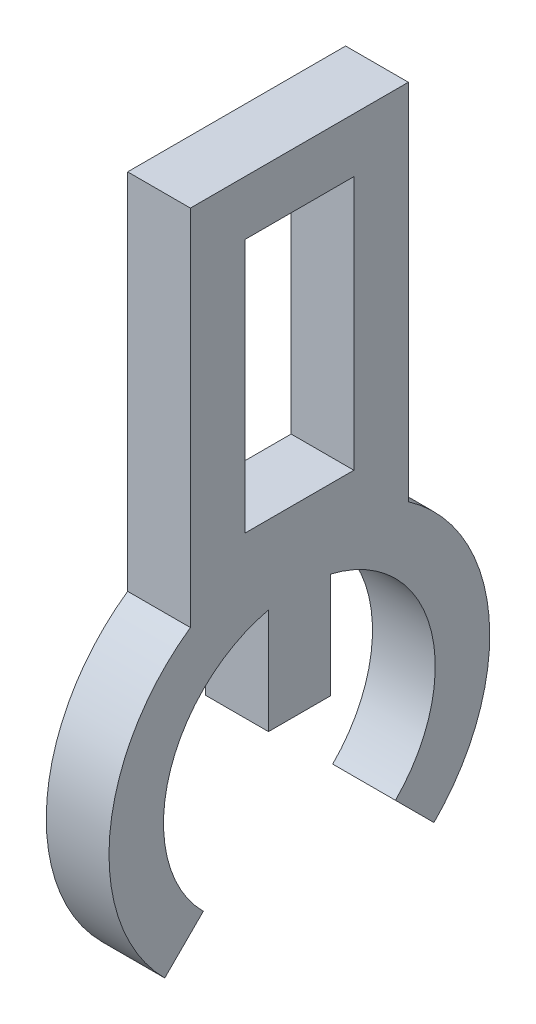
ISO-10303-21;
HEADER;
FILE_DESCRIPTION(('STEP AP214'),'2;1');
FILE_NAME('part.step','',(''),(''),'','','');
FILE_SCHEMA(('AUTOMOTIVE_DESIGN { 1 0 10303 214 1 1 1 1 }'));
ENDSEC;
DATA;
#1=APPLICATION_CONTEXT('core data for automotive mechanical design processes');
#2=APPLICATION_PROTOCOL_DEFINITION('international standard','automotive_design',2000,#1);
#3=PRODUCT_CONTEXT('',#1,'mechanical');
#4=PRODUCT('Part','Part','',(#3));
#5=PRODUCT_RELATED_PRODUCT_CATEGORY('part','',(#4));
#6=PRODUCT_DEFINITION_FORMATION('','',#4);
#7=PRODUCT_DEFINITION_CONTEXT('part definition',#1,'design');
#8=PRODUCT_DEFINITION('design','',#6,#7);
#9=PRODUCT_DEFINITION_SHAPE('','',#8);
#10=(LENGTH_UNIT() NAMED_UNIT(*) SI_UNIT(.MILLI.,.METRE.));
#11=(NAMED_UNIT(*) PLANE_ANGLE_UNIT() SI_UNIT($,.RADIAN.));
#12=(NAMED_UNIT(*) SI_UNIT($,.STERADIAN.) SOLID_ANGLE_UNIT());
#13=UNCERTAINTY_MEASURE_WITH_UNIT(LENGTH_MEASURE(1.E-05),#10,'distance_accuracy_value','');
#14=(GEOMETRIC_REPRESENTATION_CONTEXT(3) GLOBAL_UNCERTAINTY_ASSIGNED_CONTEXT((#13)) GLOBAL_UNIT_ASSIGNED_CONTEXT((#10,
#11,#12)) REPRESENTATION_CONTEXT('',''));
#15=CARTESIAN_POINT('',(0.,0.,0.));
#16=DIRECTION('',(0.,0.,1.));
#17=DIRECTION('',(1.,0.,0.));
#18=AXIS2_PLACEMENT_3D('',#15,#16,#17);
#19=CARTESIAN_POINT('',(1.7272,4.92565105429879,1.5));
#20=DIRECTION('',(0.,0.,-1.));
#21=DIRECTION('',(0.,1.,0.));
#22=AXIS2_PLACEMENT_3D('',#19,#20,#21);
#23=PLANE('',#22);
#24=DIRECTION('',(0.,-1.,0.));
#25=VECTOR('',#24,1.);
#26=CARTESIAN_POINT('',(0.,4.92565105429879,1.5));
#27=LINE('',#26,#25);
#28=CARTESIAN_POINT('',(0.,12.7962309062712,1.5));
#29=VERTEX_POINT('',#28);
#30=CARTESIAN_POINT('',(0.,5.79623090627122,1.5));
#31=VERTEX_POINT('',#30);
#32=EDGE_CURVE('E213',#29,#31,#27,.T.);
#33=ORIENTED_EDGE('',*,*,#32,.F.);
#34=DIRECTION('',(-1.,0.,0.));
#35=VECTOR('',#34,1.);
#36=CARTESIAN_POINT('',(1.7272,12.7962309062712,1.5));
#37=LINE('',#36,#35);
#38=CARTESIAN_POINT('',(1.7272,12.7962309062712,1.5));
#39=VERTEX_POINT('',#38);
#40=EDGE_CURVE('E11',#39,#29,#37,.T.);
#41=ORIENTED_EDGE('',*,*,#40,.F.);
#42=DIRECTION('',(0.,-1.,0.));
#43=VECTOR('',#42,1.);
#44=CARTESIAN_POINT('',(1.7272,4.92565105429879,1.5));
#45=LINE('',#44,#43);
#46=CARTESIAN_POINT('',(1.7272,5.79623090627122,1.5));
#47=VERTEX_POINT('',#46);
#48=EDGE_CURVE('E169',#39,#47,#45,.T.);
#49=ORIENTED_EDGE('',*,*,#48,.T.);
#50=DIRECTION('',(-1.,0.,0.));
#51=VECTOR('',#50,1.);
#52=CARTESIAN_POINT('',(1.7272,5.79623090627122,1.5));
#53=LINE('',#52,#51);
#54=EDGE_CURVE('E54',#47,#31,#53,.T.);
#55=ORIENTED_EDGE('',*,*,#54,.T.);
#56=EDGE_LOOP('',(#33,#41,#49,#55));
#57=FACE_BOUND('',#56,.T.);
#58=ADVANCED_FACE('F35',(#57),#23,.T.);
#59=CARTESIAN_POINT('',(1.7272,12.7962309062712,-15.8317009149584));
#60=DIRECTION('',(0.,1.,0.));
#61=DIRECTION('',(0.,0.,1.));
#62=AXIS2_PLACEMENT_3D('',#59,#60,#61);
#63=PLANE('',#62);
#64=DIRECTION('',(0.,0.,-1.));
#65=VECTOR('',#64,1.);
#66=CARTESIAN_POINT('',(0.,12.7962309062712,-15.8317009149584));
#67=LINE('',#66,#65);
#68=CARTESIAN_POINT('',(0.,12.7962309062712,-1.5));
#69=VERTEX_POINT('',#68);
#70=EDGE_CURVE('E174',#29,#69,#67,.T.);
#71=ORIENTED_EDGE('',*,*,#70,.T.);
#72=DIRECTION('',(-1.,0.,0.));
#73=VECTOR('',#72,1.);
#74=CARTESIAN_POINT('',(1.7272,12.7962309062712,-1.5));
#75=LINE('',#74,#73);
#76=CARTESIAN_POINT('',(1.7272,12.7962309062712,-1.5));
#77=VERTEX_POINT('',#76);
#78=EDGE_CURVE('E45',#77,#69,#75,.T.);
#79=ORIENTED_EDGE('',*,*,#78,.F.);
#80=DIRECTION('',(0.,0.,-1.));
#81=VECTOR('',#80,1.);
#82=CARTESIAN_POINT('',(1.7272,12.7962309062712,-15.8317009149584));
#83=LINE('',#82,#81);
#84=EDGE_CURVE('E164',#39,#77,#83,.T.);
#85=ORIENTED_EDGE('',*,*,#84,.F.);
#86=ORIENTED_EDGE('',*,*,#40,.T.);
#87=EDGE_LOOP('',(#71,#79,#85,#86));
#88=FACE_BOUND('',#87,.T.);
#89=ADVANCED_FACE('F172',(#88),#63,.F.);
#90=CARTESIAN_POINT('',(1.7272,4.92565105429879,-1.5));
#91=DIRECTION('',(0.,0.,-1.));
#92=DIRECTION('',(0.,1.,0.));
#93=AXIS2_PLACEMENT_3D('',#90,#91,#92);
#94=PLANE('',#93);
#95=DIRECTION('',(0.,-1.,0.));
#96=VECTOR('',#95,1.);
#97=CARTESIAN_POINT('',(0.,4.92565105429879,-1.5));
#98=LINE('',#97,#96);
#99=CARTESIAN_POINT('',(0.,5.79623090627122,-1.5));
#100=VERTEX_POINT('',#99);
#101=EDGE_CURVE('E210',#69,#100,#98,.T.);
#102=ORIENTED_EDGE('',*,*,#101,.T.);
#103=DIRECTION('',(-1.,0.,0.));
#104=VECTOR('',#103,1.);
#105=CARTESIAN_POINT('',(1.7272,5.79623090627122,-1.5));
#106=LINE('',#105,#104);
#107=CARTESIAN_POINT('',(1.7272,5.79623090627122,-1.5));
#108=VERTEX_POINT('',#107);
#109=EDGE_CURVE('E104',#108,#100,#106,.T.);
#110=ORIENTED_EDGE('',*,*,#109,.F.);
#111=DIRECTION('',(0.,-1.,0.));
#112=VECTOR('',#111,1.);
#113=CARTESIAN_POINT('',(1.7272,4.92565105429879,-1.5));
#114=LINE('',#113,#112);
#115=EDGE_CURVE('E156',#77,#108,#114,.T.);
#116=ORIENTED_EDGE('',*,*,#115,.F.);
#117=ORIENTED_EDGE('',*,*,#78,.T.);
#118=EDGE_LOOP('',(#102,#110,#116,#117));
#119=FACE_BOUND('',#118,.T.);
#120=ADVANCED_FACE('F158',(#119),#94,.F.);
#121=CARTESIAN_POINT('',(1.7272,0.,0.));
#122=DIRECTION('',(-1.,0.,0.));
#123=DIRECTION('',(0.,0.,1.));
#124=AXIS2_PLACEMENT_3D('',#121,#122,#123);
#125=CYLINDRICAL_SURFACE('',#124,3.74);
#126=CARTESIAN_POINT('',(0.,0.,0.));
#127=DIRECTION('',(1.,0.,0.));
#128=DIRECTION('',(0.,0.,-1.));
#129=AXIS2_PLACEMENT_3D('',#126,#127,#128);
#130=CIRCLE('',#129,3.74);
#131=CARTESIAN_POINT('',(0.,-2.64457936163768,2.64457936163769));
#132=VERTEX_POINT('',#131);
#133=CARTESIAN_POINT('',(0.,3.64212849855685,0.85));
#134=VERTEX_POINT('',#133);
#135=EDGE_CURVE('E245',#132,#134,#130,.F.);
#136=ORIENTED_EDGE('',*,*,#135,.T.);
#137=DIRECTION('',(-1.,0.,0.));
#138=VECTOR('',#137,1.);
#139=CARTESIAN_POINT('',(1.7272,3.64212849855685,0.85));
#140=LINE('',#139,#138);
#141=CARTESIAN_POINT('',(1.7272,3.64212849855685,0.85));
#142=VERTEX_POINT('',#141);
#143=EDGE_CURVE('E39',#142,#134,#140,.T.);
#144=ORIENTED_EDGE('',*,*,#143,.F.);
#145=CARTESIAN_POINT('',(1.7272,0.,0.));
#146=DIRECTION('',(1.,0.,0.));
#147=DIRECTION('',(0.,0.,-1.));
#148=AXIS2_PLACEMENT_3D('',#145,#146,#147);
#149=CIRCLE('',#148,3.74);
#150=CARTESIAN_POINT('',(1.7272,-2.64457936163768,2.64457936163769));
#151=VERTEX_POINT('',#150);
#152=EDGE_CURVE('E209',#151,#142,#149,.F.);
#153=ORIENTED_EDGE('',*,*,#152,.F.);
#154=DIRECTION('',(-1.,0.,0.));
#155=VECTOR('',#154,1.);
#156=CARTESIAN_POINT('',(1.7272,-2.64457936163768,2.64457936163769));
#157=LINE('',#156,#155);
#158=EDGE_CURVE('E179',#151,#132,#157,.T.);
#159=ORIENTED_EDGE('',*,*,#158,.T.);
#160=EDGE_LOOP('',(#136,#144,#153,#159));
#161=FACE_BOUND('',#160,.T.);
#162=ADVANCED_FACE('F317',(#161),#125,.F.);
#163=CARTESIAN_POINT('',(1.7272,4.92565105429879,0.85));
#164=DIRECTION('',(0.,0.,-1.));
#165=DIRECTION('',(0.,1.,0.));
#166=AXIS2_PLACEMENT_3D('',#163,#164,#165);
#167=PLANE('',#166);
#168=DIRECTION('',(0.,-1.,0.));
#169=VECTOR('',#168,1.);
#170=CARTESIAN_POINT('',(0.,4.92565105429879,0.85));
#171=LINE('',#170,#169);
#172=CARTESIAN_POINT('',(0.,0.740000000000001,0.85));
#173=VERTEX_POINT('',#172);
#174=EDGE_CURVE('E243',#134,#173,#171,.T.);
#175=ORIENTED_EDGE('',*,*,#174,.T.);
#176=DIRECTION('',(-1.,0.,0.));
#177=VECTOR('',#176,1.);
#178=CARTESIAN_POINT('',(1.7272,0.740000000000001,0.85));
#179=LINE('',#178,#177);
#180=CARTESIAN_POINT('',(1.7272,0.740000000000001,0.85));
#181=VERTEX_POINT('',#180);
#182=EDGE_CURVE('E198',#181,#173,#179,.T.);
#183=ORIENTED_EDGE('',*,*,#182,.F.);
#184=DIRECTION('',(0.,-1.,0.));
#185=VECTOR('',#184,1.);
#186=CARTESIAN_POINT('',(1.7272,4.92565105429879,0.85));
#187=LINE('',#186,#185);
#188=EDGE_CURVE('E117',#142,#181,#187,.T.);
#189=ORIENTED_EDGE('',*,*,#188,.F.);
#190=ORIENTED_EDGE('',*,*,#143,.T.);
#191=EDGE_LOOP('',(#175,#183,#189,#190));
#192=FACE_BOUND('',#191,.T.);
#193=ADVANCED_FACE('F37',(#192),#167,.F.);
#194=CARTESIAN_POINT('',(1.7272,0.739999999999998,-15.8317009149584));
#195=DIRECTION('',(0.,-1.,0.));
#196=DIRECTION('',(0.,0.,-1.));
#197=AXIS2_PLACEMENT_3D('',#194,#195,#196);
#198=PLANE('',#197);
#199=DIRECTION('',(0.,0.,1.));
#200=VECTOR('',#199,1.);
#201=CARTESIAN_POINT('',(0.,0.739999999999998,-15.8317009149584));
#202=LINE('',#201,#200);
#203=CARTESIAN_POINT('',(0.,0.74,-0.850000000000001));
#204=VERTEX_POINT('',#203);
#205=EDGE_CURVE('E240',#204,#173,#202,.T.);
#206=ORIENTED_EDGE('',*,*,#205,.F.);
#207=DIRECTION('',(-1.,0.,0.));
#208=VECTOR('',#207,1.);
#209=CARTESIAN_POINT('',(1.7272,0.74,-0.850000000000001));
#210=LINE('',#209,#208);
#211=CARTESIAN_POINT('',(1.7272,0.74,-0.850000000000001));
#212=VERTEX_POINT('',#211);
#213=EDGE_CURVE('E197',#212,#204,#210,.T.);
#214=ORIENTED_EDGE('',*,*,#213,.F.);
#215=DIRECTION('',(0.,0.,1.));
#216=VECTOR('',#215,1.);
#217=CARTESIAN_POINT('',(1.7272,0.739999999999998,-15.8317009149584));
#218=LINE('',#217,#216);
#219=EDGE_CURVE('E273',#212,#181,#218,.T.);
#220=ORIENTED_EDGE('',*,*,#219,.T.);
#221=ORIENTED_EDGE('',*,*,#182,.T.);
#222=EDGE_LOOP('',(#206,#214,#220,#221));
#223=FACE_BOUND('',#222,.T.);
#224=ADVANCED_FACE('F321',(#223),#198,.T.);
#225=CARTESIAN_POINT('',(1.7272,4.92565105429879,-0.85));
#226=DIRECTION('',(0.,0.,-1.));
#227=DIRECTION('',(0.,1.,0.));
#228=AXIS2_PLACEMENT_3D('',#225,#226,#227);
#229=PLANE('',#228);
#230=DIRECTION('',(0.,-1.,0.));
#231=VECTOR('',#230,1.);
#232=CARTESIAN_POINT('',(0.,4.92565105429879,-0.85));
#233=LINE('',#232,#231);
#234=CARTESIAN_POINT('',(0.,3.64212849855685,-0.85));
#235=VERTEX_POINT('',#234);
#236=EDGE_CURVE('E237',#235,#204,#233,.T.);
#237=ORIENTED_EDGE('',*,*,#236,.F.);
#238=DIRECTION('',(-1.,0.,0.));
#239=VECTOR('',#238,1.);
#240=CARTESIAN_POINT('',(1.7272,3.64212849855685,-0.85));
#241=LINE('',#240,#239);
#242=CARTESIAN_POINT('',(1.7272,3.64212849855685,-0.85));
#243=VERTEX_POINT('',#242);
#244=EDGE_CURVE('E195',#243,#235,#241,.T.);
#245=ORIENTED_EDGE('',*,*,#244,.F.);
#246=DIRECTION('',(0.,-1.,0.));
#247=VECTOR('',#246,1.);
#248=CARTESIAN_POINT('',(1.7272,4.92565105429879,-0.85));
#249=LINE('',#248,#247);
#250=EDGE_CURVE('E270',#243,#212,#249,.T.);
#251=ORIENTED_EDGE('',*,*,#250,.T.);
#252=ORIENTED_EDGE('',*,*,#213,.T.);
#253=EDGE_LOOP('',(#237,#245,#251,#252));
#254=FACE_BOUND('',#253,.T.);
#255=ADVANCED_FACE('F324',(#254),#229,.T.);
#256=CARTESIAN_POINT('',(0.,-2.64457936163768,-2.64457936163769));
#257=VERTEX_POINT('',#256);
#258=EDGE_CURVE('E236',#235,#257,#130,.F.);
#259=ORIENTED_EDGE('',*,*,#258,.T.);
#260=DIRECTION('',(-1.,0.,0.));
#261=VECTOR('',#260,1.);
#262=CARTESIAN_POINT('',(1.7272,-2.64457936163768,-2.64457936163769));
#263=LINE('',#262,#261);
#264=CARTESIAN_POINT('',(1.7272,-2.64457936163768,-2.64457936163769));
#265=VERTEX_POINT('',#264);
#266=EDGE_CURVE('E193',#265,#257,#263,.T.);
#267=ORIENTED_EDGE('',*,*,#266,.F.);
#268=EDGE_CURVE('E269',#243,#265,#149,.F.);
#269=ORIENTED_EDGE('',*,*,#268,.F.);
#270=ORIENTED_EDGE('',*,*,#244,.T.);
#271=EDGE_LOOP('',(#259,#267,#269,#270));
#272=FACE_BOUND('',#271,.T.);
#273=ADVANCED_FACE('F287',(#272),#125,.F.);
#274=CARTESIAN_POINT('',(1.7272,-5.45302493032982,-5.45302493032983));
#275=DIRECTION('',(0.,-0.707106781186548,0.707106781186547));
#276=DIRECTION('',(0.,-0.707106781186547,-0.707106781186548));
#277=AXIS2_PLACEMENT_3D('',#274,#275,#276);
#278=PLANE('',#277);
#279=DIRECTION('',(0.,0.707106781186547,0.707106781186548));
#280=VECTOR('',#279,1.);
#281=CARTESIAN_POINT('',(0.,-5.45302493032982,-5.45302493032983));
#282=LINE('',#281,#280);
#283=CARTESIAN_POINT('',(0.,-3.7052395334175,-3.70523953341751));
#284=VERTEX_POINT('',#283);
#285=EDGE_CURVE('E233',#284,#257,#282,.T.);
#286=ORIENTED_EDGE('',*,*,#285,.F.);
#287=DIRECTION('',(-1.,0.,0.));
#288=VECTOR('',#287,1.);
#289=CARTESIAN_POINT('',(1.7272,-3.7052395334175,-3.70523953341751));
#290=LINE('',#289,#288);
#291=CARTESIAN_POINT('',(1.7272,-3.7052395334175,-3.70523953341751));
#292=VERTEX_POINT('',#291);
#293=EDGE_CURVE('E191',#292,#284,#290,.T.);
#294=ORIENTED_EDGE('',*,*,#293,.F.);
#295=DIRECTION('',(0.,0.707106781186547,0.707106781186548));
#296=VECTOR('',#295,1.);
#297=CARTESIAN_POINT('',(1.7272,-5.45302493032982,-5.45302493032983));
#298=LINE('',#297,#296);
#299=EDGE_CURVE('E266',#292,#265,#298,.T.);
#300=ORIENTED_EDGE('',*,*,#299,.T.);
#301=ORIENTED_EDGE('',*,*,#266,.T.);
#302=EDGE_LOOP('',(#286,#294,#300,#301));
#303=FACE_BOUND('',#302,.T.);
#304=ADVANCED_FACE('F291',(#303),#278,.T.);
#305=CARTESIAN_POINT('',(1.7272,0.,0.));
#306=DIRECTION('',(-1.,0.,0.));
#307=DIRECTION('',(0.,0.,1.));
#308=AXIS2_PLACEMENT_3D('',#305,#306,#307);
#309=CYLINDRICAL_SURFACE('',#308,5.24);
#310=CARTESIAN_POINT('',(0.,0.,0.));
#311=DIRECTION('',(1.,0.,0.));
#312=DIRECTION('',(0.,0.,-1.));
#313=AXIS2_PLACEMENT_3D('',#310,#311,#312);
#314=CIRCLE('',#313,5.24);
#315=CARTESIAN_POINT('',(0.,4.29623090627122,-3.));
#316=VERTEX_POINT('',#315);
#317=EDGE_CURVE('E230',#316,#284,#314,.F.);
#318=ORIENTED_EDGE('',*,*,#317,.F.);
#319=DIRECTION('',(-1.,0.,0.));
#320=VECTOR('',#319,1.);
#321=CARTESIAN_POINT('',(1.7272,4.29623090627122,-3.));
#322=LINE('',#321,#320);
#323=CARTESIAN_POINT('',(1.7272,4.29623090627122,-3.));
#324=VERTEX_POINT('',#323);
#325=EDGE_CURVE('E189',#324,#316,#322,.T.);
#326=ORIENTED_EDGE('',*,*,#325,.F.);
#327=CARTESIAN_POINT('',(1.7272,0.,0.));
#328=DIRECTION('',(1.,0.,0.));
#329=DIRECTION('',(0.,0.,-1.));
#330=AXIS2_PLACEMENT_3D('',#327,#328,#329);
#331=CIRCLE('',#330,5.24);
#332=EDGE_CURVE('E263',#324,#292,#331,.F.);
#333=ORIENTED_EDGE('',*,*,#332,.T.);
#334=ORIENTED_EDGE('',*,*,#293,.T.);
#335=EDGE_LOOP('',(#318,#326,#333,#334));
#336=FACE_BOUND('',#335,.T.);
#337=ADVANCED_FACE('F294',(#336),#309,.T.);
#338=CARTESIAN_POINT('',(1.7272,4.92565105429879,-3.));
#339=DIRECTION('',(0.,0.,-1.));
#340=DIRECTION('',(0.,1.,0.));
#341=AXIS2_PLACEMENT_3D('',#338,#339,#340);
#342=PLANE('',#341);
#343=DIRECTION('',(0.,-1.,0.));
#344=VECTOR('',#343,1.);
#345=CARTESIAN_POINT('',(0.,4.92565105429879,-3.));
#346=LINE('',#345,#344);
#347=CARTESIAN_POINT('',(0.,14.2962309062712,-3.));
#348=VERTEX_POINT('',#347);
#349=EDGE_CURVE('E227',#348,#316,#346,.T.);
#350=ORIENTED_EDGE('',*,*,#349,.F.);
#351=DIRECTION('',(-1.,0.,0.));
#352=VECTOR('',#351,1.);
#353=CARTESIAN_POINT('',(1.7272,14.2962309062712,-3.));
#354=LINE('',#353,#352);
#355=CARTESIAN_POINT('',(1.7272,14.2962309062712,-3.));
#356=VERTEX_POINT('',#355);
#357=EDGE_CURVE('E187',#356,#348,#354,.T.);
#358=ORIENTED_EDGE('',*,*,#357,.F.);
#359=DIRECTION('',(0.,-1.,0.));
#360=VECTOR('',#359,1.);
#361=CARTESIAN_POINT('',(1.7272,4.92565105429879,-3.));
#362=LINE('',#361,#360);
#363=EDGE_CURVE('E260',#356,#324,#362,.T.);
#364=ORIENTED_EDGE('',*,*,#363,.T.);
#365=ORIENTED_EDGE('',*,*,#325,.T.);
#366=EDGE_LOOP('',(#350,#358,#364,#365));
#367=FACE_BOUND('',#366,.T.);
#368=ADVANCED_FACE('F299',(#367),#342,.T.);
#369=CARTESIAN_POINT('',(1.7272,14.2962309062712,-15.8317009149584));
#370=DIRECTION('',(0.,1.,0.));
#371=DIRECTION('',(0.,0.,1.));
#372=AXIS2_PLACEMENT_3D('',#369,#370,#371);
#373=PLANE('',#372);
#374=DIRECTION('',(0.,0.,-1.));
#375=VECTOR('',#374,1.);
#376=CARTESIAN_POINT('',(0.,14.2962309062712,-15.8317009149584));
#377=LINE('',#376,#375);
#378=CARTESIAN_POINT('',(0.,14.2962309062712,3.));
#379=VERTEX_POINT('',#378);
#380=EDGE_CURVE('E224',#379,#348,#377,.T.);
#381=ORIENTED_EDGE('',*,*,#380,.F.);
#382=DIRECTION('',(-1.,0.,0.));
#383=VECTOR('',#382,1.);
#384=CARTESIAN_POINT('',(1.7272,14.2962309062712,3.));
#385=LINE('',#384,#383);
#386=CARTESIAN_POINT('',(1.7272,14.2962309062712,3.));
#387=VERTEX_POINT('',#386);
#388=EDGE_CURVE('E185',#387,#379,#385,.T.);
#389=ORIENTED_EDGE('',*,*,#388,.F.);
#390=DIRECTION('',(0.,0.,-1.));
#391=VECTOR('',#390,1.);
#392=CARTESIAN_POINT('',(1.7272,14.2962309062712,-15.8317009149584));
#393=LINE('',#392,#391);
#394=EDGE_CURVE('E257',#387,#356,#393,.T.);
#395=ORIENTED_EDGE('',*,*,#394,.T.);
#396=ORIENTED_EDGE('',*,*,#357,.T.);
#397=EDGE_LOOP('',(#381,#389,#395,#396));
#398=FACE_BOUND('',#397,.T.);
#399=ADVANCED_FACE('F302',(#398),#373,.T.);
#400=CARTESIAN_POINT('',(1.7272,4.92565105429879,3.));
#401=DIRECTION('',(0.,0.,-1.));
#402=DIRECTION('',(0.,1.,0.));
#403=AXIS2_PLACEMENT_3D('',#400,#401,#402);
#404=PLANE('',#403);
#405=DIRECTION('',(0.,-1.,0.));
#406=VECTOR('',#405,1.);
#407=CARTESIAN_POINT('',(0.,4.92565105429879,3.));
#408=LINE('',#407,#406);
#409=CARTESIAN_POINT('',(0.,4.29623090627122,3.));
#410=VERTEX_POINT('',#409);
#411=EDGE_CURVE('E221',#379,#410,#408,.T.);
#412=ORIENTED_EDGE('',*,*,#411,.T.);
#413=DIRECTION('',(-1.,0.,0.));
#414=VECTOR('',#413,1.);
#415=CARTESIAN_POINT('',(1.7272,4.29623090627122,3.));
#416=LINE('',#415,#414);
#417=CARTESIAN_POINT('',(1.7272,4.29623090627122,3.));
#418=VERTEX_POINT('',#417);
#419=EDGE_CURVE('E183',#418,#410,#416,.T.);
#420=ORIENTED_EDGE('',*,*,#419,.F.);
#421=DIRECTION('',(0.,-1.,0.));
#422=VECTOR('',#421,1.);
#423=CARTESIAN_POINT('',(1.7272,4.92565105429879,3.));
#424=LINE('',#423,#422);
#425=EDGE_CURVE('E255',#387,#418,#424,.T.);
#426=ORIENTED_EDGE('',*,*,#425,.F.);
#427=ORIENTED_EDGE('',*,*,#388,.T.);
#428=EDGE_LOOP('',(#412,#420,#426,#427));
#429=FACE_BOUND('',#428,.T.);
#430=ADVANCED_FACE('F307',(#429),#404,.F.);
#431=CARTESIAN_POINT('',(1.7272,0.,0.));
#432=DIRECTION('',(-1.,0.,0.));
#433=DIRECTION('',(0.,0.,1.));
#434=AXIS2_PLACEMENT_3D('',#431,#432,#433);
#435=CYLINDRICAL_SURFACE('',#434,5.24);
#436=CARTESIAN_POINT('',(0.,0.,0.));
#437=DIRECTION('',(1.,0.,0.));
#438=DIRECTION('',(0.,0.,-1.));
#439=AXIS2_PLACEMENT_3D('',#436,#437,#438);
#440=CIRCLE('',#439,5.24);
#441=CARTESIAN_POINT('',(0.,-3.7052395334175,3.70523953341752));
#442=VERTEX_POINT('',#441);
#443=EDGE_CURVE('E218',#442,#410,#440,.F.);
#444=ORIENTED_EDGE('',*,*,#443,.F.);
#445=DIRECTION('',(-1.,0.,0.));
#446=VECTOR('',#445,1.);
#447=CARTESIAN_POINT('',(1.7272,-3.7052395334175,3.70523953341752));
#448=LINE('',#447,#446);
#449=CARTESIAN_POINT('',(1.7272,-3.7052395334175,3.70523953341752));
#450=VERTEX_POINT('',#449);
#451=EDGE_CURVE('E181',#450,#442,#448,.T.);
#452=ORIENTED_EDGE('',*,*,#451,.F.);
#453=CARTESIAN_POINT('',(1.7272,0.,0.));
#454=DIRECTION('',(1.,0.,0.));
#455=DIRECTION('',(0.,0.,-1.));
#456=AXIS2_PLACEMENT_3D('',#453,#454,#455);
#457=CIRCLE('',#456,5.24);
#458=EDGE_CURVE('E252',#450,#418,#457,.F.);
#459=ORIENTED_EDGE('',*,*,#458,.T.);
#460=ORIENTED_EDGE('',*,*,#419,.T.);
#461=EDGE_LOOP('',(#444,#452,#459,#460));
#462=FACE_BOUND('',#461,.T.);
#463=ADVANCED_FACE('F311',(#462),#435,.T.);
#464=CARTESIAN_POINT('',(1.7272,10.3786759846286,-10.3786759846287));
#465=DIRECTION('',(0.,-0.707106781186552,-0.707106781186543));
#466=DIRECTION('',(0.,0.707106781186543,-0.707106781186552));
#467=AXIS2_PLACEMENT_3D('',#464,#465,#466);
#468=PLANE('',#467);
#469=DIRECTION('',(0.,-0.707106781186543,0.707106781186552));
#470=VECTOR('',#469,1.);
#471=CARTESIAN_POINT('',(0.,10.3786759846286,-10.3786759846287));
#472=LINE('',#471,#470);
#473=EDGE_CURVE('E215',#132,#442,#472,.T.);
#474=ORIENTED_EDGE('',*,*,#473,.F.);
#475=ORIENTED_EDGE('',*,*,#158,.F.);
#476=DIRECTION('',(0.,-0.707106781186543,0.707106781186552));
#477=VECTOR('',#476,1.);
#478=CARTESIAN_POINT('',(1.7272,10.3786759846286,-10.3786759846287));
#479=LINE('',#478,#477);
#480=EDGE_CURVE('E249',#151,#450,#479,.T.);
#481=ORIENTED_EDGE('',*,*,#480,.T.);
#482=ORIENTED_EDGE('',*,*,#451,.T.);
#483=EDGE_LOOP('',(#474,#475,#481,#482));
#484=FACE_BOUND('',#483,.T.);
#485=ADVANCED_FACE('F314',(#484),#468,.T.);
#486=CARTESIAN_POINT('',(1.7272,5.79623090627122,-15.8317009149584));
#487=DIRECTION('',(0.,1.,0.));
#488=DIRECTION('',(0.,0.,1.));
#489=AXIS2_PLACEMENT_3D('',#486,#487,#488);
#490=PLANE('',#489);
#491=DIRECTION('',(0.,0.,-1.));
#492=VECTOR('',#491,1.);
#493=CARTESIAN_POINT('',(0.,5.79623090627122,-15.8317009149584));
#494=LINE('',#493,#492);
#495=EDGE_CURVE('E206',#31,#100,#494,.T.);
#496=ORIENTED_EDGE('',*,*,#495,.F.);
#497=ORIENTED_EDGE('',*,*,#54,.F.);
#498=DIRECTION('',(0.,0.,-1.));
#499=VECTOR('',#498,1.);
#500=CARTESIAN_POINT('',(1.7272,5.79623090627122,-15.8317009149584));
#501=LINE('',#500,#499);
#502=EDGE_CURVE('E163',#47,#108,#501,.T.);
#503=ORIENTED_EDGE('',*,*,#502,.T.);
#504=ORIENTED_EDGE('',*,*,#109,.T.);
#505=EDGE_LOOP('',(#496,#497,#503,#504));
#506=FACE_BOUND('',#505,.T.);
#507=ADVANCED_FACE('F342',(#506),#490,.T.);
#508=CARTESIAN_POINT('',(1.7272,4.92565105429879,-15.8317009149584));
#509=DIRECTION('',(1.,0.,0.));
#510=DIRECTION('',(0.,0.,-1.));
#511=AXIS2_PLACEMENT_3D('',#508,#509,#510);
#512=PLANE('',#511);
#513=ORIENTED_EDGE('',*,*,#152,.T.);
#514=ORIENTED_EDGE('',*,*,#188,.T.);
#515=ORIENTED_EDGE('',*,*,#219,.F.);
#516=ORIENTED_EDGE('',*,*,#250,.F.);
#517=ORIENTED_EDGE('',*,*,#268,.T.);
#518=ORIENTED_EDGE('',*,*,#299,.F.);
#519=ORIENTED_EDGE('',*,*,#332,.F.);
#520=ORIENTED_EDGE('',*,*,#363,.F.);
#521=ORIENTED_EDGE('',*,*,#394,.F.);
#522=ORIENTED_EDGE('',*,*,#425,.T.);
#523=ORIENTED_EDGE('',*,*,#458,.F.);
#524=ORIENTED_EDGE('',*,*,#480,.F.);
#525=EDGE_LOOP('',(#513,#514,#515,#516,#517,#518,#519,#520,#521,#522,#523,#524));
#526=FACE_BOUND('',#525,.T.);
#527=ORIENTED_EDGE('',*,*,#48,.F.);
#528=ORIENTED_EDGE('',*,*,#84,.T.);
#529=ORIENTED_EDGE('',*,*,#115,.T.);
#530=ORIENTED_EDGE('',*,*,#502,.F.);
#531=EDGE_LOOP('',(#527,#528,#529,#530));
#532=FACE_BOUND('',#531,.T.);
#533=ADVANCED_FACE('F168',(#526,#532),#512,.T.);
#534=CARTESIAN_POINT('',(0.,4.92565105429879,-15.8317009149584));
#535=DIRECTION('',(1.,0.,0.));
#536=DIRECTION('',(0.,0.,-1.));
#537=AXIS2_PLACEMENT_3D('',#534,#535,#536);
#538=PLANE('',#537);
#539=ORIENTED_EDGE('',*,*,#135,.F.);
#540=ORIENTED_EDGE('',*,*,#473,.T.);
#541=ORIENTED_EDGE('',*,*,#443,.T.);
#542=ORIENTED_EDGE('',*,*,#411,.F.);
#543=ORIENTED_EDGE('',*,*,#380,.T.);
#544=ORIENTED_EDGE('',*,*,#349,.T.);
#545=ORIENTED_EDGE('',*,*,#317,.T.);
#546=ORIENTED_EDGE('',*,*,#285,.T.);
#547=ORIENTED_EDGE('',*,*,#258,.F.);
#548=ORIENTED_EDGE('',*,*,#236,.T.);
#549=ORIENTED_EDGE('',*,*,#205,.T.);
#550=ORIENTED_EDGE('',*,*,#174,.F.);
#551=EDGE_LOOP('',(#539,#540,#541,#542,#543,#544,#545,#546,#547,#548,#549,#550));
#552=FACE_BOUND('',#551,.T.);
#553=ORIENTED_EDGE('',*,*,#32,.T.);
#554=ORIENTED_EDGE('',*,*,#495,.T.);
#555=ORIENTED_EDGE('',*,*,#101,.F.);
#556=ORIENTED_EDGE('',*,*,#70,.F.);
#557=EDGE_LOOP('',(#553,#554,#555,#556));
#558=FACE_BOUND('',#557,.T.);
#559=ADVANCED_FACE('F319',(#552,#558),#538,.F.);
#560=CLOSED_SHELL('',(#58,#89,#120,#162,#193,#224,#255,#273,#304,#337,#368,#399,#430,#463,#485,
#507,#533,#559));
#561=MANIFOLD_SOLID_BREP('B2',#560);
#562=ADVANCED_BREP_SHAPE_REPRESENTATION('',(#18,#561),#14);
#563=SHAPE_DEFINITION_REPRESENTATION(#9,#562);
ENDSEC;
END-ISO-10303-21;
